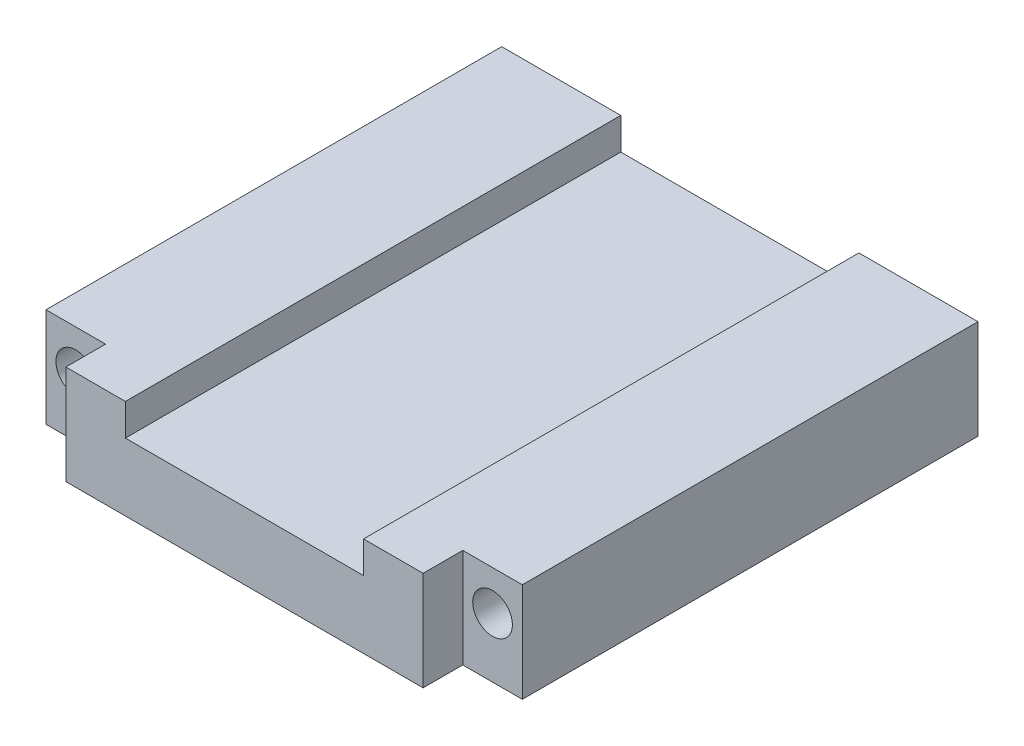
ISO-10303-21;
HEADER;
FILE_DESCRIPTION(('STEP AP214'),'2;1');
FILE_NAME('part.step','',(''),(''),'','','');
FILE_SCHEMA(('AUTOMOTIVE_DESIGN { 1 0 10303 214 1 1 1 1 }'));
ENDSEC;
DATA;
#1=APPLICATION_CONTEXT('core data for automotive mechanical design processes');
#2=APPLICATION_PROTOCOL_DEFINITION('international standard','automotive_design',2000,#1);
#3=PRODUCT_CONTEXT('',#1,'mechanical');
#4=PRODUCT('Part','Part','',(#3));
#5=PRODUCT_RELATED_PRODUCT_CATEGORY('part','',(#4));
#6=PRODUCT_DEFINITION_FORMATION('','',#4);
#7=PRODUCT_DEFINITION_CONTEXT('part definition',#1,'design');
#8=PRODUCT_DEFINITION('design','',#6,#7);
#9=PRODUCT_DEFINITION_SHAPE('','',#8);
#10=(LENGTH_UNIT() NAMED_UNIT(*) SI_UNIT(.MILLI.,.METRE.));
#11=(NAMED_UNIT(*) PLANE_ANGLE_UNIT() SI_UNIT($,.RADIAN.));
#12=(NAMED_UNIT(*) SI_UNIT($,.STERADIAN.) SOLID_ANGLE_UNIT());
#13=UNCERTAINTY_MEASURE_WITH_UNIT(LENGTH_MEASURE(1.E-05),#10,'distance_accuracy_value','');
#14=(GEOMETRIC_REPRESENTATION_CONTEXT(3) GLOBAL_UNCERTAINTY_ASSIGNED_CONTEXT((#13)) GLOBAL_UNIT_ASSIGNED_CONTEXT((#10,
#11,#12)) REPRESENTATION_CONTEXT('',''));
#15=CARTESIAN_POINT('',(0.,0.,0.));
#16=DIRECTION('',(0.,0.,1.));
#17=DIRECTION('',(1.,0.,0.));
#18=AXIS2_PLACEMENT_3D('',#15,#16,#17);
#19=CARTESIAN_POINT('',(-19.05,-3.96875,39.624));
#20=DIRECTION('',(1.,0.,0.));
#21=DIRECTION('',(0.,0.,-1.));
#22=AXIS2_PLACEMENT_3D('',#19,#20,#21);
#23=PLANE('',#22);
#24=DIRECTION('',(0.,-1.,0.));
#25=VECTOR('',#24,1.);
#26=CARTESIAN_POINT('',(-19.05,3.96875,36.449));
#27=LINE('',#26,#25);
#28=CARTESIAN_POINT('',(-19.05,3.96875,36.449));
#29=VERTEX_POINT('',#28);
#30=CARTESIAN_POINT('',(-19.05,-3.96875,36.449));
#31=VERTEX_POINT('',#30);
#32=EDGE_CURVE('E122',#29,#31,#27,.T.);
#33=ORIENTED_EDGE('',*,*,#32,.F.);
#34=DIRECTION('',(0.,0.,-1.));
#35=VECTOR('',#34,1.);
#36=CARTESIAN_POINT('',(-19.05,3.96875,39.624));
#37=LINE('',#36,#35);
#38=CARTESIAN_POINT('',(-19.05,3.96875,0.));
#39=VERTEX_POINT('',#38);
#40=EDGE_CURVE('E145',#29,#39,#37,.T.);
#41=ORIENTED_EDGE('',*,*,#40,.T.);
#42=DIRECTION('',(0.,-1.,0.));
#43=VECTOR('',#42,1.);
#44=CARTESIAN_POINT('',(-19.05,-3.96875,0.));
#45=LINE('',#44,#43);
#46=CARTESIAN_POINT('',(-19.05,-3.96875,0.));
#47=VERTEX_POINT('',#46);
#48=EDGE_CURVE('E144',#39,#47,#45,.T.);
#49=ORIENTED_EDGE('',*,*,#48,.T.);
#50=DIRECTION('',(0.,0.,-1.));
#51=VECTOR('',#50,1.);
#52=CARTESIAN_POINT('',(-19.05,-3.96875,39.624));
#53=LINE('',#52,#51);
#54=EDGE_CURVE('E11',#31,#47,#53,.T.);
#55=ORIENTED_EDGE('',*,*,#54,.F.);
#56=EDGE_LOOP('',(#33,#41,#49,#55));
#57=FACE_BOUND('',#56,.T.);
#58=ADVANCED_FACE('F33',(#57),#23,.F.);
#59=CARTESIAN_POINT('',(-16.66875,0.793750000000003,0.));
#60=DIRECTION('',(0.,0.,-1.));
#61=DIRECTION('',(-1.,0.,0.));
#62=AXIS2_PLACEMENT_3D('',#59,#60,#61);
#63=CYLINDRICAL_SURFACE('',#62,1.58749999999999);
#64=CARTESIAN_POINT('',(-16.66875,0.793750000000003,0.));
#65=DIRECTION('',(0.,0.,-1.));
#66=DIRECTION('',(-1.,0.,0.));
#67=AXIS2_PLACEMENT_3D('',#64,#65,#66);
#68=CIRCLE('',#67,1.58749999999999);
#69=CARTESIAN_POINT('',(-18.25625,0.793750000000003,0.));
#70=VERTEX_POINT('',#69);
#71=EDGE_CURVE('E205',#70,#70,#68,.T.);
#72=ORIENTED_EDGE('',*,*,#71,.T.);
#73=EDGE_LOOP('',(#72));
#74=FACE_BOUND('',#73,.T.);
#75=CARTESIAN_POINT('',(-16.66875,0.793750000000003,36.449));
#76=DIRECTION('',(0.,0.,1.));
#77=DIRECTION('',(1.,0.,0.));
#78=AXIS2_PLACEMENT_3D('',#75,#76,#77);
#79=CIRCLE('',#78,1.58749999999999);
#80=CARTESIAN_POINT('',(-15.08125,0.793750000000003,36.449));
#81=VERTEX_POINT('',#80);
#82=EDGE_CURVE('E36',#81,#81,#79,.F.);
#83=ORIENTED_EDGE('',*,*,#82,.F.);
#84=EDGE_LOOP('',(#83));
#85=FACE_BOUND('',#84,.T.);
#86=ADVANCED_FACE('F275',(#74,#85),#63,.F.);
#87=CARTESIAN_POINT('',(0.,0.,0.));
#88=DIRECTION('',(0.,0.,1.));
#89=DIRECTION('',(1.,0.,0.));
#90=AXIS2_PLACEMENT_3D('',#87,#88,#89);
#91=PLANE('',#90);
#92=ORIENTED_EDGE('',*,*,#71,.F.);
#93=EDGE_LOOP('',(#92));
#94=FACE_BOUND('',#93,.T.);
#95=DIRECTION('',(1.,0.,0.));
#96=VECTOR('',#95,1.);
#97=CARTESIAN_POINT('',(9.525,1.42875,0.));
#98=LINE('',#97,#96);
#99=CARTESIAN_POINT('',(-9.525,1.42875,0.));
#100=VERTEX_POINT('',#99);
#101=CARTESIAN_POINT('',(9.525,1.42875,0.));
#102=VERTEX_POINT('',#101);
#103=EDGE_CURVE('E212',#100,#102,#98,.T.);
#104=ORIENTED_EDGE('',*,*,#103,.T.);
#105=DIRECTION('',(0.,1.,0.));
#106=VECTOR('',#105,1.);
#107=CARTESIAN_POINT('',(9.525,3.96875,0.));
#108=LINE('',#107,#106);
#109=CARTESIAN_POINT('',(9.525,3.96875,0.));
#110=VERTEX_POINT('',#109);
#111=EDGE_CURVE('E216',#102,#110,#108,.T.);
#112=ORIENTED_EDGE('',*,*,#111,.T.);
#113=DIRECTION('',(-1.,0.,0.));
#114=VECTOR('',#113,1.);
#115=CARTESIAN_POINT('',(19.05,3.96875,0.));
#116=LINE('',#115,#114);
#117=CARTESIAN_POINT('',(19.05,3.96875,0.));
#118=VERTEX_POINT('',#117);
#119=EDGE_CURVE('E164',#118,#110,#116,.T.);
#120=ORIENTED_EDGE('',*,*,#119,.F.);
#121=DIRECTION('',(0.,1.,0.));
#122=VECTOR('',#121,1.);
#123=CARTESIAN_POINT('',(19.05,-3.96875,0.));
#124=LINE('',#123,#122);
#125=CARTESIAN_POINT('',(19.05,-3.96875,0.));
#126=VERTEX_POINT('',#125);
#127=EDGE_CURVE('E152',#126,#118,#124,.T.);
#128=ORIENTED_EDGE('',*,*,#127,.F.);
#129=DIRECTION('',(1.,0.,0.));
#130=VECTOR('',#129,1.);
#131=CARTESIAN_POINT('',(19.05,-3.96875,0.));
#132=LINE('',#131,#130);
#133=EDGE_CURVE('E149',#47,#126,#132,.T.);
#134=ORIENTED_EDGE('',*,*,#133,.F.);
#135=ORIENTED_EDGE('',*,*,#48,.F.);
#136=CARTESIAN_POINT('',(-9.525,3.96875,0.));
#137=VERTEX_POINT('',#136);
#138=EDGE_CURVE('E163',#137,#39,#116,.T.);
#139=ORIENTED_EDGE('',*,*,#138,.F.);
#140=DIRECTION('',(0.,-1.,0.));
#141=VECTOR('',#140,1.);
#142=CARTESIAN_POINT('',(-9.525,1.42875,0.));
#143=LINE('',#142,#141);
#144=EDGE_CURVE('E209',#137,#100,#143,.T.);
#145=ORIENTED_EDGE('',*,*,#144,.T.);
#146=EDGE_LOOP('',(#104,#112,#120,#128,#134,#135,#139,#145));
#147=FACE_BOUND('',#146,.T.);
#148=CARTESIAN_POINT('',(16.66875,0.793750000000003,0.));
#149=DIRECTION('',(0.,0.,-1.));
#150=DIRECTION('',(-1.,0.,0.));
#151=AXIS2_PLACEMENT_3D('',#148,#149,#150);
#152=CIRCLE('',#151,1.58749999999999);
#153=CARTESIAN_POINT('',(15.08125,0.793750000000003,0.));
#154=VERTEX_POINT('',#153);
#155=EDGE_CURVE('E177',#154,#154,#152,.T.);
#156=ORIENTED_EDGE('',*,*,#155,.F.);
#157=EDGE_LOOP('',(#156));
#158=FACE_BOUND('',#157,.T.);
#159=ADVANCED_FACE('F247',(#94,#147,#158),#91,.F.);
#160=CARTESIAN_POINT('',(19.05,3.96875,39.624));
#161=DIRECTION('',(0.,-1.,0.));
#162=DIRECTION('',(1.,0.,0.));
#163=AXIS2_PLACEMENT_3D('',#160,#161,#162);
#164=PLANE('',#163);
#165=DIRECTION('',(-1.,0.,0.));
#166=VECTOR('',#165,1.);
#167=CARTESIAN_POINT('',(19.05,3.96875,39.624));
#168=LINE('',#167,#166);
#169=CARTESIAN_POINT('',(14.2875,3.96875,39.624));
#170=VERTEX_POINT('',#169);
#171=CARTESIAN_POINT('',(9.525,3.96875,39.624));
#172=VERTEX_POINT('',#171);
#173=EDGE_CURVE('E158',#170,#172,#168,.T.);
#174=ORIENTED_EDGE('',*,*,#173,.F.);
#175=DIRECTION('',(0.,0.,1.));
#176=VECTOR('',#175,1.);
#177=CARTESIAN_POINT('',(14.2875,3.96875,36.449));
#178=LINE('',#177,#176);
#179=CARTESIAN_POINT('',(14.2875,3.96875,36.449));
#180=VERTEX_POINT('',#179);
#181=EDGE_CURVE('E49',#180,#170,#178,.T.);
#182=ORIENTED_EDGE('',*,*,#181,.F.);
#183=DIRECTION('',(-1.,0.,0.));
#184=VECTOR('',#183,1.);
#185=CARTESIAN_POINT('',(19.05,3.96875,36.449));
#186=LINE('',#185,#184);
#187=CARTESIAN_POINT('',(19.05,3.96875,36.449));
#188=VERTEX_POINT('',#187);
#189=EDGE_CURVE('E189',#188,#180,#186,.T.);
#190=ORIENTED_EDGE('',*,*,#189,.F.);
#191=DIRECTION('',(0.,0.,-1.));
#192=VECTOR('',#191,1.);
#193=CARTESIAN_POINT('',(19.05,3.96875,39.624));
#194=LINE('',#193,#192);
#195=EDGE_CURVE('E169',#188,#118,#194,.T.);
#196=ORIENTED_EDGE('',*,*,#195,.T.);
#197=ORIENTED_EDGE('',*,*,#119,.T.);
#198=DIRECTION('',(0.,0.,1.));
#199=VECTOR('',#198,1.);
#200=CARTESIAN_POINT('',(9.525,3.96875,0.));
#201=LINE('',#200,#199);
#202=EDGE_CURVE('E150',#110,#172,#201,.T.);
#203=ORIENTED_EDGE('',*,*,#202,.T.);
#204=EDGE_LOOP('',(#174,#182,#190,#196,#197,#203));
#205=FACE_BOUND('',#204,.T.);
#206=ADVANCED_FACE('F242',(#205),#164,.F.);
#207=CARTESIAN_POINT('',(19.05,-3.96875,39.624));
#208=DIRECTION('',(0.,1.,0.));
#209=DIRECTION('',(-1.,0.,0.));
#210=AXIS2_PLACEMENT_3D('',#207,#208,#209);
#211=PLANE('',#210);
#212=DIRECTION('',(1.,0.,0.));
#213=VECTOR('',#212,1.);
#214=CARTESIAN_POINT('',(19.05,-3.96875,39.624));
#215=LINE('',#214,#213);
#216=CARTESIAN_POINT('',(-14.2875,-3.96875,39.624));
#217=VERTEX_POINT('',#216);
#218=CARTESIAN_POINT('',(14.2875,-3.96875,39.624));
#219=VERTEX_POINT('',#218);
#220=EDGE_CURVE('E167',#217,#219,#215,.T.);
#221=ORIENTED_EDGE('',*,*,#220,.F.);
#222=DIRECTION('',(0.,0.,1.));
#223=VECTOR('',#222,1.);
#224=CARTESIAN_POINT('',(-14.2875,-3.96875,36.449));
#225=LINE('',#224,#223);
#226=CARTESIAN_POINT('',(-14.2875,-3.96875,36.449));
#227=VERTEX_POINT('',#226);
#228=EDGE_CURVE('E57',#227,#217,#225,.T.);
#229=ORIENTED_EDGE('',*,*,#228,.F.);
#230=DIRECTION('',(1.,0.,0.));
#231=VECTOR('',#230,1.);
#232=CARTESIAN_POINT('',(-19.05,-3.96875,36.449));
#233=LINE('',#232,#231);
#234=EDGE_CURVE('E127',#31,#227,#233,.T.);
#235=ORIENTED_EDGE('',*,*,#234,.F.);
#236=ORIENTED_EDGE('',*,*,#54,.T.);
#237=ORIENTED_EDGE('',*,*,#133,.T.);
#238=DIRECTION('',(0.,0.,-1.));
#239=VECTOR('',#238,1.);
#240=CARTESIAN_POINT('',(19.05,-3.96875,39.624));
#241=LINE('',#240,#239);
#242=CARTESIAN_POINT('',(19.05,-3.96875,36.449));
#243=VERTEX_POINT('',#242);
#244=EDGE_CURVE('E41',#243,#126,#241,.T.);
#245=ORIENTED_EDGE('',*,*,#244,.F.);
#246=DIRECTION('',(1.,0.,0.));
#247=VECTOR('',#246,1.);
#248=CARTESIAN_POINT('',(19.05,-3.96875,36.449));
#249=LINE('',#248,#247);
#250=CARTESIAN_POINT('',(14.2875,-3.96875,36.449));
#251=VERTEX_POINT('',#250);
#252=EDGE_CURVE('E196',#251,#243,#249,.T.);
#253=ORIENTED_EDGE('',*,*,#252,.F.);
#254=DIRECTION('',(0.,0.,1.));
#255=VECTOR('',#254,1.);
#256=CARTESIAN_POINT('',(14.2875,-3.96875,36.449));
#257=LINE('',#256,#255);
#258=EDGE_CURVE('E199',#251,#219,#257,.T.);
#259=ORIENTED_EDGE('',*,*,#258,.T.);
#260=EDGE_LOOP('',(#221,#229,#235,#236,#237,#245,#253,#259));
#261=FACE_BOUND('',#260,.T.);
#262=ADVANCED_FACE('F137',(#261),#211,.F.);
#263=CARTESIAN_POINT('',(19.05,-3.96875,39.624));
#264=DIRECTION('',(-1.,0.,0.));
#265=DIRECTION('',(0.,0.,1.));
#266=AXIS2_PLACEMENT_3D('',#263,#264,#265);
#267=PLANE('',#266);
#268=ORIENTED_EDGE('',*,*,#195,.F.);
#269=DIRECTION('',(0.,1.,0.));
#270=VECTOR('',#269,1.);
#271=CARTESIAN_POINT('',(19.05,3.96875,36.449));
#272=LINE('',#271,#270);
#273=EDGE_CURVE('E187',#243,#188,#272,.T.);
#274=ORIENTED_EDGE('',*,*,#273,.F.);
#275=ORIENTED_EDGE('',*,*,#244,.T.);
#276=ORIENTED_EDGE('',*,*,#127,.T.);
#277=EDGE_LOOP('',(#268,#274,#275,#276));
#278=FACE_BOUND('',#277,.T.);
#279=ADVANCED_FACE('F266',(#278),#267,.F.);
#280=DIRECTION('',(-1.,0.,0.));
#281=VECTOR('',#280,1.);
#282=CARTESIAN_POINT('',(-19.05,3.96875,36.449));
#283=LINE('',#282,#281);
#284=CARTESIAN_POINT('',(-14.2875,3.96875,36.449));
#285=VERTEX_POINT('',#284);
#286=EDGE_CURVE('E129',#285,#29,#283,.T.);
#287=ORIENTED_EDGE('',*,*,#286,.F.);
#288=DIRECTION('',(0.,0.,1.));
#289=VECTOR('',#288,1.);
#290=CARTESIAN_POINT('',(-14.2875,3.96875,36.449));
#291=LINE('',#290,#289);
#292=CARTESIAN_POINT('',(-14.2875,3.96875,39.624));
#293=VERTEX_POINT('',#292);
#294=EDGE_CURVE('E173',#285,#293,#291,.T.);
#295=ORIENTED_EDGE('',*,*,#294,.T.);
#296=CARTESIAN_POINT('',(-9.525,3.96875,39.624));
#297=VERTEX_POINT('',#296);
#298=EDGE_CURVE('E231',#297,#293,#168,.T.);
#299=ORIENTED_EDGE('',*,*,#298,.F.);
#300=DIRECTION('',(0.,0.,1.));
#301=VECTOR('',#300,1.);
#302=CARTESIAN_POINT('',(-9.525,3.96875,0.));
#303=LINE('',#302,#301);
#304=EDGE_CURVE('E219',#137,#297,#303,.T.);
#305=ORIENTED_EDGE('',*,*,#304,.F.);
#306=ORIENTED_EDGE('',*,*,#138,.T.);
#307=ORIENTED_EDGE('',*,*,#40,.F.);
#308=EDGE_LOOP('',(#287,#295,#299,#305,#306,#307));
#309=FACE_BOUND('',#308,.T.);
#310=ADVANCED_FACE('F255',(#309),#164,.F.);
#311=CARTESIAN_POINT('',(0.,0.,39.624));
#312=DIRECTION('',(0.,0.,1.));
#313=DIRECTION('',(1.,0.,0.));
#314=AXIS2_PLACEMENT_3D('',#311,#312,#313);
#315=PLANE('',#314);
#316=DIRECTION('',(0.,1.,0.));
#317=VECTOR('',#316,1.);
#318=CARTESIAN_POINT('',(-14.2875,3.96875,39.624));
#319=LINE('',#318,#317);
#320=EDGE_CURVE('E133',#217,#293,#319,.T.);
#321=ORIENTED_EDGE('',*,*,#320,.F.);
#322=ORIENTED_EDGE('',*,*,#220,.T.);
#323=DIRECTION('',(0.,-1.,0.));
#324=VECTOR('',#323,1.);
#325=CARTESIAN_POINT('',(14.2875,3.96875,39.624));
#326=LINE('',#325,#324);
#327=EDGE_CURVE('E190',#170,#219,#326,.T.);
#328=ORIENTED_EDGE('',*,*,#327,.F.);
#329=ORIENTED_EDGE('',*,*,#173,.T.);
#330=DIRECTION('',(0.,1.,0.));
#331=VECTOR('',#330,1.);
#332=CARTESIAN_POINT('',(9.525,3.96875,39.624));
#333=LINE('',#332,#331);
#334=CARTESIAN_POINT('',(9.525,1.42875,39.624));
#335=VERTEX_POINT('',#334);
#336=EDGE_CURVE('E213',#335,#172,#333,.T.);
#337=ORIENTED_EDGE('',*,*,#336,.F.);
#338=DIRECTION('',(1.,0.,0.));
#339=VECTOR('',#338,1.);
#340=CARTESIAN_POINT('',(9.525,1.42875,39.624));
#341=LINE('',#340,#339);
#342=CARTESIAN_POINT('',(-9.525,1.42875,39.624));
#343=VERTEX_POINT('',#342);
#344=EDGE_CURVE('E222',#343,#335,#341,.T.);
#345=ORIENTED_EDGE('',*,*,#344,.F.);
#346=DIRECTION('',(0.,-1.,0.));
#347=VECTOR('',#346,1.);
#348=CARTESIAN_POINT('',(-9.525,1.42875,39.624));
#349=LINE('',#348,#347);
#350=EDGE_CURVE('E208',#297,#343,#349,.T.);
#351=ORIENTED_EDGE('',*,*,#350,.F.);
#352=ORIENTED_EDGE('',*,*,#298,.T.);
#353=EDGE_LOOP('',(#321,#322,#328,#329,#337,#345,#351,#352));
#354=FACE_BOUND('',#353,.T.);
#355=ADVANCED_FACE('F236',(#354),#315,.T.);
#356=CARTESIAN_POINT('',(9.525,3.96875,0.));
#357=DIRECTION('',(1.,0.,0.));
#358=DIRECTION('',(0.,0.,-1.));
#359=AXIS2_PLACEMENT_3D('',#356,#357,#358);
#360=PLANE('',#359);
#361=ORIENTED_EDGE('',*,*,#336,.T.);
#362=ORIENTED_EDGE('',*,*,#202,.F.);
#363=ORIENTED_EDGE('',*,*,#111,.F.);
#364=DIRECTION('',(0.,0.,1.));
#365=VECTOR('',#364,1.);
#366=CARTESIAN_POINT('',(9.525,1.42875,0.));
#367=LINE('',#366,#365);
#368=EDGE_CURVE('E155',#102,#335,#367,.T.);
#369=ORIENTED_EDGE('',*,*,#368,.T.);
#370=EDGE_LOOP('',(#361,#362,#363,#369));
#371=FACE_BOUND('',#370,.T.);
#372=ADVANCED_FACE('F240',(#371),#360,.F.);
#373=CARTESIAN_POINT('',(9.525,1.42875,0.));
#374=DIRECTION('',(0.,-1.,0.));
#375=DIRECTION('',(0.,0.,-1.));
#376=AXIS2_PLACEMENT_3D('',#373,#374,#375);
#377=PLANE('',#376);
#378=ORIENTED_EDGE('',*,*,#344,.T.);
#379=ORIENTED_EDGE('',*,*,#368,.F.);
#380=ORIENTED_EDGE('',*,*,#103,.F.);
#381=DIRECTION('',(0.,0.,1.));
#382=VECTOR('',#381,1.);
#383=CARTESIAN_POINT('',(-9.525,1.42875,0.));
#384=LINE('',#383,#382);
#385=EDGE_CURVE('E228',#100,#343,#384,.T.);
#386=ORIENTED_EDGE('',*,*,#385,.T.);
#387=EDGE_LOOP('',(#378,#379,#380,#386));
#388=FACE_BOUND('',#387,.T.);
#389=ADVANCED_FACE('F251',(#388),#377,.F.);
#390=CARTESIAN_POINT('',(-9.525,1.42875,0.));
#391=DIRECTION('',(-1.,0.,0.));
#392=DIRECTION('',(0.,0.,1.));
#393=AXIS2_PLACEMENT_3D('',#390,#391,#392);
#394=PLANE('',#393);
#395=ORIENTED_EDGE('',*,*,#350,.T.);
#396=ORIENTED_EDGE('',*,*,#385,.F.);
#397=ORIENTED_EDGE('',*,*,#144,.F.);
#398=ORIENTED_EDGE('',*,*,#304,.T.);
#399=EDGE_LOOP('',(#395,#396,#397,#398));
#400=FACE_BOUND('',#399,.T.);
#401=ADVANCED_FACE('F253',(#400),#394,.F.);
#402=CARTESIAN_POINT('',(16.66875,0.793750000000003,0.));
#403=DIRECTION('',(0.,0.,-1.));
#404=DIRECTION('',(-1.,0.,0.));
#405=AXIS2_PLACEMENT_3D('',#402,#403,#404);
#406=CYLINDRICAL_SURFACE('',#405,1.58749999999999);
#407=CARTESIAN_POINT('',(16.66875,0.793750000000003,36.449));
#408=DIRECTION('',(0.,0.,-1.));
#409=DIRECTION('',(-1.,0.,0.));
#410=AXIS2_PLACEMENT_3D('',#407,#408,#409);
#411=CIRCLE('',#410,1.58749999999999);
#412=CARTESIAN_POINT('',(15.08125,0.793750000000003,36.449));
#413=VERTEX_POINT('',#412);
#414=EDGE_CURVE('E171',#413,#413,#411,.F.);
#415=ORIENTED_EDGE('',*,*,#414,.T.);
#416=EDGE_LOOP('',(#415));
#417=FACE_BOUND('',#416,.T.);
#418=ORIENTED_EDGE('',*,*,#155,.T.);
#419=EDGE_LOOP('',(#418));
#420=FACE_BOUND('',#419,.T.);
#421=ADVANCED_FACE('F291',(#417,#420),#406,.F.);
#422=CARTESIAN_POINT('',(0.,0.,36.449));
#423=DIRECTION('',(0.,0.,-1.));
#424=DIRECTION('',(-1.,0.,0.));
#425=AXIS2_PLACEMENT_3D('',#422,#423,#424);
#426=PLANE('',#425);
#427=ORIENTED_EDGE('',*,*,#273,.T.);
#428=ORIENTED_EDGE('',*,*,#189,.T.);
#429=DIRECTION('',(0.,-1.,0.));
#430=VECTOR('',#429,1.);
#431=CARTESIAN_POINT('',(14.2875,3.96875,36.449));
#432=LINE('',#431,#430);
#433=EDGE_CURVE('E193',#180,#251,#432,.T.);
#434=ORIENTED_EDGE('',*,*,#433,.T.);
#435=ORIENTED_EDGE('',*,*,#252,.T.);
#436=EDGE_LOOP('',(#427,#428,#434,#435));
#437=FACE_BOUND('',#436,.T.);
#438=ORIENTED_EDGE('',*,*,#414,.F.);
#439=EDGE_LOOP('',(#438));
#440=FACE_BOUND('',#439,.T.);
#441=ADVANCED_FACE('F262',(#437,#440),#426,.F.);
#442=CARTESIAN_POINT('',(14.2875,3.96875,36.449));
#443=DIRECTION('',(-1.,0.,0.));
#444=DIRECTION('',(0.,0.,1.));
#445=AXIS2_PLACEMENT_3D('',#442,#443,#444);
#446=PLANE('',#445);
#447=ORIENTED_EDGE('',*,*,#327,.T.);
#448=ORIENTED_EDGE('',*,*,#258,.F.);
#449=ORIENTED_EDGE('',*,*,#433,.F.);
#450=ORIENTED_EDGE('',*,*,#181,.T.);
#451=EDGE_LOOP('',(#447,#448,#449,#450));
#452=FACE_BOUND('',#451,.T.);
#453=ADVANCED_FACE('F260',(#452),#446,.F.);
#454=CARTESIAN_POINT('',(0.,0.,36.449));
#455=DIRECTION('',(0.,0.,1.));
#456=DIRECTION('',(1.,0.,0.));
#457=AXIS2_PLACEMENT_3D('',#454,#455,#456);
#458=PLANE('',#457);
#459=ORIENTED_EDGE('',*,*,#32,.T.);
#460=ORIENTED_EDGE('',*,*,#234,.T.);
#461=DIRECTION('',(0.,1.,0.));
#462=VECTOR('',#461,1.);
#463=CARTESIAN_POINT('',(-14.2875,3.96875,36.449));
#464=LINE('',#463,#462);
#465=EDGE_CURVE('E140',#227,#285,#464,.T.);
#466=ORIENTED_EDGE('',*,*,#465,.T.);
#467=ORIENTED_EDGE('',*,*,#286,.T.);
#468=EDGE_LOOP('',(#459,#460,#466,#467));
#469=FACE_BOUND('',#468,.T.);
#470=ORIENTED_EDGE('',*,*,#82,.T.);
#471=EDGE_LOOP('',(#470));
#472=FACE_BOUND('',#471,.T.);
#473=ADVANCED_FACE('F124',(#469,#472),#458,.T.);
#474=CARTESIAN_POINT('',(-14.2875,3.96875,36.449));
#475=DIRECTION('',(1.,0.,0.));
#476=DIRECTION('',(0.,0.,-1.));
#477=AXIS2_PLACEMENT_3D('',#474,#475,#476);
#478=PLANE('',#477);
#479=ORIENTED_EDGE('',*,*,#320,.T.);
#480=ORIENTED_EDGE('',*,*,#294,.F.);
#481=ORIENTED_EDGE('',*,*,#465,.F.);
#482=ORIENTED_EDGE('',*,*,#228,.T.);
#483=EDGE_LOOP('',(#479,#480,#481,#482));
#484=FACE_BOUND('',#483,.T.);
#485=ADVANCED_FACE('F257',(#484),#478,.F.);
#486=CLOSED_SHELL('',(#58,#86,#159,#206,#262,#279,#310,#355,#372,#389,#401,#421,#441,#453,#473,#485));
#487=MANIFOLD_SOLID_BREP('B2',#486);
#488=ADVANCED_BREP_SHAPE_REPRESENTATION('',(#18,#487),#14);
#489=SHAPE_DEFINITION_REPRESENTATION(#9,#488);
ENDSEC;
END-ISO-10303-21;
